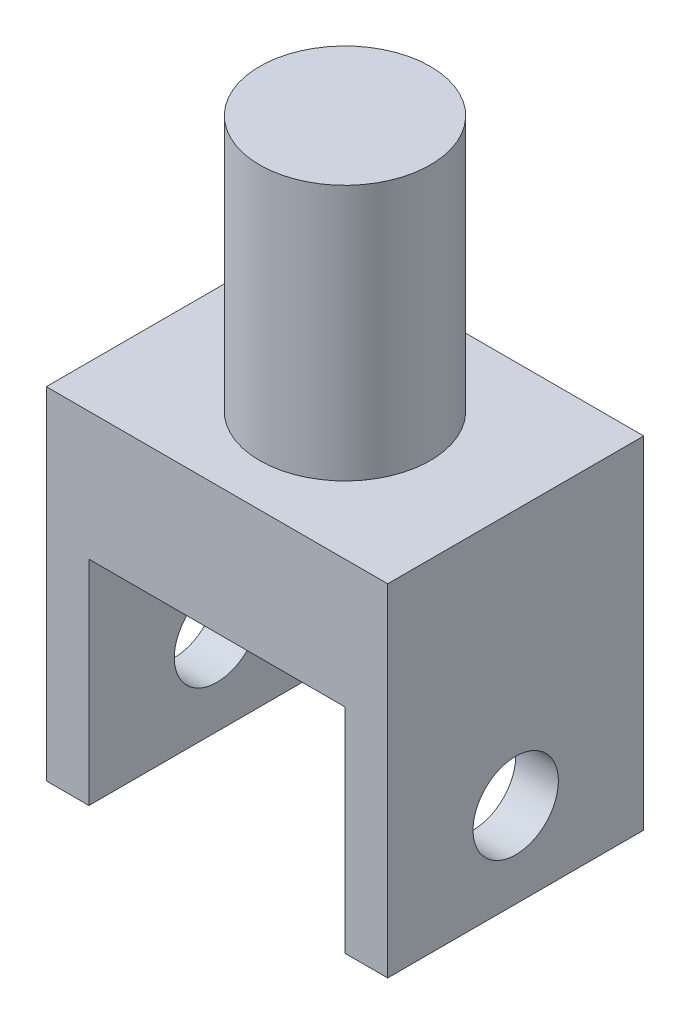
ISO-10303-21;
HEADER;
FILE_DESCRIPTION(('STEP AP214'),'2;1');
FILE_NAME('part.step','',(''),(''),'','','');
FILE_SCHEMA(('AUTOMOTIVE_DESIGN { 1 0 10303 214 1 1 1 1 }'));
ENDSEC;
DATA;
#1=APPLICATION_CONTEXT('core data for automotive mechanical design processes');
#2=APPLICATION_PROTOCOL_DEFINITION('international standard','automotive_design',2000,#1);
#3=PRODUCT_CONTEXT('',#1,'mechanical');
#4=PRODUCT('Part','Part','',(#3));
#5=PRODUCT_RELATED_PRODUCT_CATEGORY('part','',(#4));
#6=PRODUCT_DEFINITION_FORMATION('','',#4);
#7=PRODUCT_DEFINITION_CONTEXT('part definition',#1,'design');
#8=PRODUCT_DEFINITION('design','',#6,#7);
#9=PRODUCT_DEFINITION_SHAPE('','',#8);
#10=(LENGTH_UNIT() NAMED_UNIT(*) SI_UNIT(.MILLI.,.METRE.));
#11=(NAMED_UNIT(*) PLANE_ANGLE_UNIT() SI_UNIT($,.RADIAN.));
#12=(NAMED_UNIT(*) SI_UNIT($,.STERADIAN.) SOLID_ANGLE_UNIT());
#13=UNCERTAINTY_MEASURE_WITH_UNIT(LENGTH_MEASURE(1.E-05),#10,'distance_accuracy_value','');
#14=(GEOMETRIC_REPRESENTATION_CONTEXT(3) GLOBAL_UNCERTAINTY_ASSIGNED_CONTEXT((#13)) GLOBAL_UNIT_ASSIGNED_CONTEXT((#10,
#11,#12)) REPRESENTATION_CONTEXT('',''));
#15=CARTESIAN_POINT('',(0.,0.,0.));
#16=DIRECTION('',(0.,0.,1.));
#17=DIRECTION('',(1.,0.,0.));
#18=AXIS2_PLACEMENT_3D('',#15,#16,#17);
#19=CARTESIAN_POINT('',(0.,0.,0.));
#20=DIRECTION('',(0.,-1.,0.));
#21=DIRECTION('',(0.,0.,-1.));
#22=AXIS2_PLACEMENT_3D('',#19,#20,#21);
#23=PLANE('',#22);
#24=DIRECTION('',(0.,0.,1.));
#25=VECTOR('',#24,1.);
#26=CARTESIAN_POINT('',(38.1,0.,-38.1));
#27=LINE('',#26,#25);
#28=CARTESIAN_POINT('',(38.1,0.,-38.1));
#29=VERTEX_POINT('',#28);
#30=CARTESIAN_POINT('',(38.1,0.,38.1));
#31=VERTEX_POINT('',#30);
#32=EDGE_CURVE('E114',#29,#31,#27,.T.);
#33=ORIENTED_EDGE('',*,*,#32,.F.);
#34=DIRECTION('',(-1.,0.,0.));
#35=VECTOR('',#34,1.);
#36=CARTESIAN_POINT('',(-50.8,0.,-38.1));
#37=LINE('',#36,#35);
#38=CARTESIAN_POINT('',(50.8,0.,-38.1));
#39=VERTEX_POINT('',#38);
#40=EDGE_CURVE('E156',#39,#29,#37,.T.);
#41=ORIENTED_EDGE('',*,*,#40,.F.);
#42=DIRECTION('',(0.,0.,-1.));
#43=VECTOR('',#42,1.);
#44=CARTESIAN_POINT('',(50.8,0.,38.1));
#45=LINE('',#44,#43);
#46=CARTESIAN_POINT('',(50.8,0.,38.1));
#47=VERTEX_POINT('',#46);
#48=EDGE_CURVE('E140',#47,#39,#45,.T.);
#49=ORIENTED_EDGE('',*,*,#48,.F.);
#50=DIRECTION('',(1.,0.,0.));
#51=VECTOR('',#50,1.);
#52=CARTESIAN_POINT('',(-50.8,0.,38.1));
#53=LINE('',#52,#51);
#54=EDGE_CURVE('E80',#31,#47,#53,.T.);
#55=ORIENTED_EDGE('',*,*,#54,.F.);
#56=EDGE_LOOP('',(#33,#41,#49,#55));
#57=FACE_BOUND('',#56,.T.);
#58=ADVANCED_FACE('F33',(#57),#23,.T.);
#59=CARTESIAN_POINT('',(50.8,101.6,38.1));
#60=DIRECTION('',(-1.,0.,0.));
#61=DIRECTION('',(0.,0.,1.));
#62=AXIS2_PLACEMENT_3D('',#59,#60,#61);
#63=PLANE('',#62);
#64=CARTESIAN_POINT('',(50.8,25.4,0.));
#65=DIRECTION('',(1.,0.,0.));
#66=DIRECTION('',(0.,0.,-1.));
#67=AXIS2_PLACEMENT_3D('',#64,#65,#66);
#68=CIRCLE('',#67,12.7);
#69=CARTESIAN_POINT('',(50.8,25.4,-12.7));
#70=VERTEX_POINT('',#69);
#71=EDGE_CURVE('E227',#70,#70,#68,.T.);
#72=ORIENTED_EDGE('',*,*,#71,.F.);
#73=EDGE_LOOP('',(#72));
#74=FACE_BOUND('',#73,.T.);
#75=ORIENTED_EDGE('',*,*,#48,.T.);
#76=DIRECTION('',(0.,-1.,0.));
#77=VECTOR('',#76,1.);
#78=CARTESIAN_POINT('',(50.8,101.6,-38.1));
#79=LINE('',#78,#77);
#80=CARTESIAN_POINT('',(50.8,101.6,-38.1));
#81=VERTEX_POINT('',#80);
#82=EDGE_CURVE('E42',#81,#39,#79,.T.);
#83=ORIENTED_EDGE('',*,*,#82,.F.);
#84=DIRECTION('',(0.,0.,-1.));
#85=VECTOR('',#84,1.);
#86=CARTESIAN_POINT('',(50.8,101.6,38.1));
#87=LINE('',#86,#85);
#88=CARTESIAN_POINT('',(50.8,101.6,38.1));
#89=VERTEX_POINT('',#88);
#90=EDGE_CURVE('E145',#89,#81,#87,.T.);
#91=ORIENTED_EDGE('',*,*,#90,.F.);
#92=DIRECTION('',(0.,-1.,0.));
#93=VECTOR('',#92,1.);
#94=CARTESIAN_POINT('',(50.8,101.6,38.1));
#95=LINE('',#94,#93);
#96=EDGE_CURVE('E152',#89,#47,#95,.T.);
#97=ORIENTED_EDGE('',*,*,#96,.T.);
#98=EDGE_LOOP('',(#75,#83,#91,#97));
#99=FACE_BOUND('',#98,.T.);
#100=ADVANCED_FACE('F35',(#74,#99),#63,.F.);
#101=CARTESIAN_POINT('',(-50.8,101.6,-38.1));
#102=DIRECTION('',(0.,0.,1.));
#103=DIRECTION('',(1.,0.,0.));
#104=AXIS2_PLACEMENT_3D('',#101,#102,#103);
#105=PLANE('',#104);
#106=ORIENTED_EDGE('',*,*,#40,.T.);
#107=DIRECTION('',(0.,-1.,0.));
#108=VECTOR('',#107,1.);
#109=CARTESIAN_POINT('',(38.1,63.5,-38.1));
#110=LINE('',#109,#108);
#111=CARTESIAN_POINT('',(38.1,63.5,-38.1));
#112=VERTEX_POINT('',#111);
#113=EDGE_CURVE('E138',#112,#29,#110,.T.);
#114=ORIENTED_EDGE('',*,*,#113,.F.);
#115=DIRECTION('',(1.,0.,0.));
#116=VECTOR('',#115,1.);
#117=CARTESIAN_POINT('',(-38.1,63.5,-38.1));
#118=LINE('',#117,#116);
#119=CARTESIAN_POINT('',(-38.1,63.5,-38.1));
#120=VERTEX_POINT('',#119);
#121=EDGE_CURVE('E116',#120,#112,#118,.T.);
#122=ORIENTED_EDGE('',*,*,#121,.F.);
#123=DIRECTION('',(0.,-1.,0.));
#124=VECTOR('',#123,1.);
#125=CARTESIAN_POINT('',(-38.1,63.5,-38.1));
#126=LINE('',#125,#124);
#127=CARTESIAN_POINT('',(-38.1,0.,-38.1));
#128=VERTEX_POINT('',#127);
#129=EDGE_CURVE('E141',#120,#128,#126,.T.);
#130=ORIENTED_EDGE('',*,*,#129,.T.);
#131=CARTESIAN_POINT('',(-50.8,0.,-38.1));
#132=VERTEX_POINT('',#131);
#133=EDGE_CURVE('E155',#128,#132,#37,.T.);
#134=ORIENTED_EDGE('',*,*,#133,.T.);
#135=DIRECTION('',(0.,-1.,0.));
#136=VECTOR('',#135,1.);
#137=CARTESIAN_POINT('',(-50.8,101.6,-38.1));
#138=LINE('',#137,#136);
#139=CARTESIAN_POINT('',(-50.8,101.6,-38.1));
#140=VERTEX_POINT('',#139);
#141=EDGE_CURVE('E166',#140,#132,#138,.T.);
#142=ORIENTED_EDGE('',*,*,#141,.F.);
#143=DIRECTION('',(-1.,0.,0.));
#144=VECTOR('',#143,1.);
#145=CARTESIAN_POINT('',(-50.8,101.6,-38.1));
#146=LINE('',#145,#144);
#147=EDGE_CURVE('E88',#81,#140,#146,.T.);
#148=ORIENTED_EDGE('',*,*,#147,.F.);
#149=ORIENTED_EDGE('',*,*,#82,.T.);
#150=EDGE_LOOP('',(#106,#114,#122,#130,#134,#142,#148,#149));
#151=FACE_BOUND('',#150,.T.);
#152=ADVANCED_FACE('F169',(#151),#105,.F.);
#153=CARTESIAN_POINT('',(-50.8,101.6,38.1));
#154=DIRECTION('',(1.,0.,0.));
#155=DIRECTION('',(0.,0.,-1.));
#156=AXIS2_PLACEMENT_3D('',#153,#154,#155);
#157=PLANE('',#156);
#158=CARTESIAN_POINT('',(-50.8,25.4,0.));
#159=DIRECTION('',(1.,0.,0.));
#160=DIRECTION('',(0.,0.,-1.));
#161=AXIS2_PLACEMENT_3D('',#158,#159,#160);
#162=CIRCLE('',#161,12.7);
#163=CARTESIAN_POINT('',(-50.8,25.4,-12.7));
#164=VERTEX_POINT('',#163);
#165=EDGE_CURVE('E230',#164,#164,#162,.T.);
#166=ORIENTED_EDGE('',*,*,#165,.T.);
#167=EDGE_LOOP('',(#166));
#168=FACE_BOUND('',#167,.T.);
#169=DIRECTION('',(0.,0.,1.));
#170=VECTOR('',#169,1.);
#171=CARTESIAN_POINT('',(-50.8,0.,38.1));
#172=LINE('',#171,#170);
#173=CARTESIAN_POINT('',(-50.8,0.,38.1));
#174=VERTEX_POINT('',#173);
#175=EDGE_CURVE('E159',#132,#174,#172,.T.);
#176=ORIENTED_EDGE('',*,*,#175,.T.);
#177=DIRECTION('',(0.,-1.,0.));
#178=VECTOR('',#177,1.);
#179=CARTESIAN_POINT('',(-50.8,101.6,38.1));
#180=LINE('',#179,#178);
#181=CARTESIAN_POINT('',(-50.8,101.6,38.1));
#182=VERTEX_POINT('',#181);
#183=EDGE_CURVE('E163',#182,#174,#180,.T.);
#184=ORIENTED_EDGE('',*,*,#183,.F.);
#185=DIRECTION('',(0.,0.,1.));
#186=VECTOR('',#185,1.);
#187=CARTESIAN_POINT('',(-50.8,101.6,38.1));
#188=LINE('',#187,#186);
#189=EDGE_CURVE('E149',#140,#182,#188,.T.);
#190=ORIENTED_EDGE('',*,*,#189,.F.);
#191=ORIENTED_EDGE('',*,*,#141,.T.);
#192=EDGE_LOOP('',(#176,#184,#190,#191));
#193=FACE_BOUND('',#192,.T.);
#194=ADVANCED_FACE('F200',(#168,#193),#157,.F.);
#195=CARTESIAN_POINT('',(-50.8,101.6,38.1));
#196=DIRECTION('',(0.,0.,-1.));
#197=DIRECTION('',(-1.,0.,0.));
#198=AXIS2_PLACEMENT_3D('',#195,#196,#197);
#199=PLANE('',#198);
#200=DIRECTION('',(-1.,0.,0.));
#201=VECTOR('',#200,1.);
#202=CARTESIAN_POINT('',(-38.1,63.5,38.1));
#203=LINE('',#202,#201);
#204=CARTESIAN_POINT('',(38.1,63.5,38.1));
#205=VERTEX_POINT('',#204);
#206=CARTESIAN_POINT('',(-38.1,63.5,38.1));
#207=VERTEX_POINT('',#206);
#208=EDGE_CURVE('E122',#205,#207,#203,.T.);
#209=ORIENTED_EDGE('',*,*,#208,.F.);
#210=DIRECTION('',(0.,-1.,0.));
#211=VECTOR('',#210,1.);
#212=CARTESIAN_POINT('',(38.1,63.5,38.1));
#213=LINE('',#212,#211);
#214=EDGE_CURVE('E108',#205,#31,#213,.T.);
#215=ORIENTED_EDGE('',*,*,#214,.T.);
#216=ORIENTED_EDGE('',*,*,#54,.T.);
#217=ORIENTED_EDGE('',*,*,#96,.F.);
#218=DIRECTION('',(1.,0.,0.));
#219=VECTOR('',#218,1.);
#220=CARTESIAN_POINT('',(-50.8,101.6,38.1));
#221=LINE('',#220,#219);
#222=EDGE_CURVE('E59',#182,#89,#221,.T.);
#223=ORIENTED_EDGE('',*,*,#222,.F.);
#224=ORIENTED_EDGE('',*,*,#183,.T.);
#225=CARTESIAN_POINT('',(-38.1,0.,38.1));
#226=VERTEX_POINT('',#225);
#227=EDGE_CURVE('E147',#174,#226,#53,.T.);
#228=ORIENTED_EDGE('',*,*,#227,.T.);
#229=DIRECTION('',(0.,-1.,0.));
#230=VECTOR('',#229,1.);
#231=CARTESIAN_POINT('',(-38.1,63.5,38.1));
#232=LINE('',#231,#230);
#233=EDGE_CURVE('E50',#207,#226,#232,.T.);
#234=ORIENTED_EDGE('',*,*,#233,.F.);
#235=EDGE_LOOP('',(#209,#215,#216,#217,#223,#224,#228,#234));
#236=FACE_BOUND('',#235,.T.);
#237=ADVANCED_FACE('F127',(#236),#199,.F.);
#238=CARTESIAN_POINT('',(0.,101.6,0.));
#239=DIRECTION('',(0.,-1.,0.));
#240=DIRECTION('',(0.,0.,-1.));
#241=AXIS2_PLACEMENT_3D('',#238,#239,#240);
#242=PLANE('',#241);
#243=CARTESIAN_POINT('',(0.,101.6,0.));
#244=DIRECTION('',(0.,1.,0.));
#245=DIRECTION('',(0.,0.,1.));
#246=AXIS2_PLACEMENT_3D('',#243,#244,#245);
#247=CIRCLE('',#246,25.4);
#248=CARTESIAN_POINT('',(0.,101.6,-25.4));
#249=VERTEX_POINT('',#248);
#250=EDGE_CURVE('E11',#249,#249,#247,.T.);
#251=ORIENTED_EDGE('',*,*,#250,.F.);
#252=EDGE_LOOP('',(#251));
#253=FACE_BOUND('',#252,.T.);
#254=ORIENTED_EDGE('',*,*,#90,.T.);
#255=ORIENTED_EDGE('',*,*,#147,.T.);
#256=ORIENTED_EDGE('',*,*,#189,.T.);
#257=ORIENTED_EDGE('',*,*,#222,.T.);
#258=EDGE_LOOP('',(#254,#255,#256,#257));
#259=FACE_BOUND('',#258,.T.);
#260=ADVANCED_FACE('F184',(#253,#259),#242,.F.);
#261=DIRECTION('',(0.,0.,-1.));
#262=VECTOR('',#261,1.);
#263=CARTESIAN_POINT('',(-38.1,0.,-38.1));
#264=LINE('',#263,#262);
#265=EDGE_CURVE('E125',#226,#128,#264,.T.);
#266=ORIENTED_EDGE('',*,*,#265,.F.);
#267=ORIENTED_EDGE('',*,*,#227,.F.);
#268=ORIENTED_EDGE('',*,*,#175,.F.);
#269=ORIENTED_EDGE('',*,*,#133,.F.);
#270=EDGE_LOOP('',(#266,#267,#268,#269));
#271=FACE_BOUND('',#270,.T.);
#272=ADVANCED_FACE('F176',(#271),#23,.T.);
#273=CARTESIAN_POINT('',(38.1,63.5,-38.1));
#274=DIRECTION('',(1.,0.,0.));
#275=DIRECTION('',(0.,0.,-1.));
#276=AXIS2_PLACEMENT_3D('',#273,#274,#275);
#277=PLANE('',#276);
#278=CARTESIAN_POINT('',(38.1,25.4,0.));
#279=DIRECTION('',(1.,0.,0.));
#280=DIRECTION('',(0.,0.,-1.));
#281=AXIS2_PLACEMENT_3D('',#278,#279,#280);
#282=CIRCLE('',#281,12.7);
#283=CARTESIAN_POINT('',(38.1,25.4,-12.7));
#284=VERTEX_POINT('',#283);
#285=EDGE_CURVE('E136',#284,#284,#282,.T.);
#286=ORIENTED_EDGE('',*,*,#285,.T.);
#287=EDGE_LOOP('',(#286));
#288=FACE_BOUND('',#287,.T.);
#289=ORIENTED_EDGE('',*,*,#32,.T.);
#290=ORIENTED_EDGE('',*,*,#214,.F.);
#291=DIRECTION('',(0.,0.,1.));
#292=VECTOR('',#291,1.);
#293=CARTESIAN_POINT('',(38.1,63.5,-38.1));
#294=LINE('',#293,#292);
#295=EDGE_CURVE('E111',#112,#205,#294,.T.);
#296=ORIENTED_EDGE('',*,*,#295,.F.);
#297=ORIENTED_EDGE('',*,*,#113,.T.);
#298=EDGE_LOOP('',(#289,#290,#296,#297));
#299=FACE_BOUND('',#298,.T.);
#300=ADVANCED_FACE('F110',(#288,#299),#277,.F.);
#301=CARTESIAN_POINT('',(-38.1,63.5,-38.1));
#302=DIRECTION('',(-1.,0.,0.));
#303=DIRECTION('',(0.,0.,1.));
#304=AXIS2_PLACEMENT_3D('',#301,#302,#303);
#305=PLANE('',#304);
#306=CARTESIAN_POINT('',(-38.1,25.4,0.));
#307=DIRECTION('',(-1.,0.,0.));
#308=DIRECTION('',(0.,0.,1.));
#309=AXIS2_PLACEMENT_3D('',#306,#307,#308);
#310=CIRCLE('',#309,12.7);
#311=CARTESIAN_POINT('',(-38.1,25.4,12.7));
#312=VERTEX_POINT('',#311);
#313=EDGE_CURVE('E37',#312,#312,#310,.T.);
#314=ORIENTED_EDGE('',*,*,#313,.T.);
#315=EDGE_LOOP('',(#314));
#316=FACE_BOUND('',#315,.T.);
#317=ORIENTED_EDGE('',*,*,#265,.T.);
#318=ORIENTED_EDGE('',*,*,#129,.F.);
#319=DIRECTION('',(0.,0.,-1.));
#320=VECTOR('',#319,1.);
#321=CARTESIAN_POINT('',(-38.1,63.5,-38.1));
#322=LINE('',#321,#320);
#323=EDGE_CURVE('E129',#207,#120,#322,.T.);
#324=ORIENTED_EDGE('',*,*,#323,.F.);
#325=ORIENTED_EDGE('',*,*,#233,.T.);
#326=EDGE_LOOP('',(#317,#318,#324,#325));
#327=FACE_BOUND('',#326,.T.);
#328=ADVANCED_FACE('F190',(#316,#327),#305,.F.);
#329=CARTESIAN_POINT('',(0.,63.5,0.));
#330=DIRECTION('',(0.,1.,0.));
#331=DIRECTION('',(0.,0.,1.));
#332=AXIS2_PLACEMENT_3D('',#329,#330,#331);
#333=PLANE('',#332);
#334=ORIENTED_EDGE('',*,*,#295,.T.);
#335=ORIENTED_EDGE('',*,*,#208,.T.);
#336=ORIENTED_EDGE('',*,*,#323,.T.);
#337=ORIENTED_EDGE('',*,*,#121,.T.);
#338=EDGE_LOOP('',(#334,#335,#336,#337));
#339=FACE_BOUND('',#338,.T.);
#340=ADVANCED_FACE('F120',(#339),#333,.F.);
#341=CARTESIAN_POINT('',(-50.8,25.4,0.));
#342=DIRECTION('',(1.,0.,0.));
#343=DIRECTION('',(0.,0.,-1.));
#344=AXIS2_PLACEMENT_3D('',#341,#342,#343);
#345=CYLINDRICAL_SURFACE('',#344,12.7);
#346=ORIENTED_EDGE('',*,*,#165,.F.);
#347=EDGE_LOOP('',(#346));
#348=FACE_BOUND('',#347,.T.);
#349=ORIENTED_EDGE('',*,*,#313,.F.);
#350=EDGE_LOOP('',(#349));
#351=FACE_BOUND('',#350,.T.);
#352=ADVANCED_FACE('F207',(#348,#351),#345,.F.);
#353=ORIENTED_EDGE('',*,*,#71,.T.);
#354=EDGE_LOOP('',(#353));
#355=FACE_BOUND('',#354,.T.);
#356=ORIENTED_EDGE('',*,*,#285,.F.);
#357=EDGE_LOOP('',(#356));
#358=FACE_BOUND('',#357,.T.);
#359=ADVANCED_FACE('F211',(#355,#358),#345,.F.);
#360=CARTESIAN_POINT('',(0.,177.8,0.));
#361=DIRECTION('',(0.,-1.,0.));
#362=DIRECTION('',(0.,0.,-1.));
#363=AXIS2_PLACEMENT_3D('',#360,#361,#362);
#364=CYLINDRICAL_SURFACE('',#363,25.4);
#365=CARTESIAN_POINT('',(0.,177.8,0.));
#366=DIRECTION('',(0.,1.,0.));
#367=DIRECTION('',(0.,0.,1.));
#368=AXIS2_PLACEMENT_3D('',#365,#366,#367);
#369=CIRCLE('',#368,25.4);
#370=CARTESIAN_POINT('',(0.,177.8,-25.4));
#371=VERTEX_POINT('',#370);
#372=EDGE_CURVE('E226',#371,#371,#369,.T.);
#373=CARTESIAN_POINT('',(0.,177.8,-25.4));
#374=CARTESIAN_POINT('',(0.,177.00625,-25.4));
#375=CARTESIAN_POINT('',(0.,176.2125,-25.4));
#376=CARTESIAN_POINT('',(0.,174.625,-25.4));
#377=CARTESIAN_POINT('',(0.,173.83125,-25.4));
#378=CARTESIAN_POINT('',(0.,172.24375,-25.4));
#379=CARTESIAN_POINT('',(0.,171.45,-25.4));
#380=CARTESIAN_POINT('',(0.,169.8625,-25.4));
#381=CARTESIAN_POINT('',(0.,169.06875,-25.4));
#382=CARTESIAN_POINT('',(0.,167.48125,-25.4));
#383=CARTESIAN_POINT('',(0.,166.6875,-25.4));
#384=CARTESIAN_POINT('',(0.,165.1,-25.4));
#385=CARTESIAN_POINT('',(0.,164.30625,-25.4));
#386=CARTESIAN_POINT('',(0.,162.71875,-25.4));
#387=CARTESIAN_POINT('',(0.,161.925,-25.4));
#388=CARTESIAN_POINT('',(0.,160.3375,-25.4));
#389=CARTESIAN_POINT('',(0.,159.54375,-25.4));
#390=CARTESIAN_POINT('',(0.,157.95625,-25.4));
#391=CARTESIAN_POINT('',(0.,157.1625,-25.4));
#392=CARTESIAN_POINT('',(0.,155.575,-25.4));
#393=CARTESIAN_POINT('',(0.,154.78125,-25.4));
#394=CARTESIAN_POINT('',(0.,153.19375,-25.4));
#395=CARTESIAN_POINT('',(0.,152.4,-25.4));
#396=CARTESIAN_POINT('',(0.,150.8125,-25.4));
#397=CARTESIAN_POINT('',(0.,150.01875,-25.4));
#398=CARTESIAN_POINT('',(0.,148.43125,-25.4));
#399=CARTESIAN_POINT('',(0.,147.6375,-25.4));
#400=CARTESIAN_POINT('',(0.,146.05,-25.4));
#401=CARTESIAN_POINT('',(0.,145.25625,-25.4));
#402=CARTESIAN_POINT('',(0.,143.66875,-25.4));
#403=CARTESIAN_POINT('',(0.,142.875,-25.4));
#404=CARTESIAN_POINT('',(0.,141.2875,-25.4));
#405=CARTESIAN_POINT('',(0.,140.49375,-25.4));
#406=CARTESIAN_POINT('',(0.,138.90625,-25.4));
#407=CARTESIAN_POINT('',(0.,138.1125,-25.4));
#408=CARTESIAN_POINT('',(0.,136.525,-25.4));
#409=CARTESIAN_POINT('',(0.,135.73125,-25.4));
#410=CARTESIAN_POINT('',(0.,134.14375,-25.4));
#411=CARTESIAN_POINT('',(0.,133.35,-25.4));
#412=CARTESIAN_POINT('',(0.,131.7625,-25.4));
#413=CARTESIAN_POINT('',(0.,130.96875,-25.4));
#414=CARTESIAN_POINT('',(0.,129.38125,-25.4));
#415=CARTESIAN_POINT('',(0.,128.5875,-25.4));
#416=CARTESIAN_POINT('',(0.,127.,-25.4));
#417=CARTESIAN_POINT('',(0.,126.20625,-25.4));
#418=CARTESIAN_POINT('',(0.,124.61875,-25.4));
#419=CARTESIAN_POINT('',(0.,123.825,-25.4));
#420=CARTESIAN_POINT('',(0.,122.2375,-25.4));
#421=CARTESIAN_POINT('',(0.,121.44375,-25.4));
#422=CARTESIAN_POINT('',(0.,119.85625,-25.4));
#423=CARTESIAN_POINT('',(0.,119.0625,-25.4));
#424=CARTESIAN_POINT('',(0.,117.475,-25.4));
#425=CARTESIAN_POINT('',(0.,116.68125,-25.4));
#426=CARTESIAN_POINT('',(0.,115.09375,-25.4));
#427=CARTESIAN_POINT('',(0.,114.3,-25.4));
#428=CARTESIAN_POINT('',(0.,112.7125,-25.4));
#429=CARTESIAN_POINT('',(0.,111.91875,-25.4));
#430=CARTESIAN_POINT('',(0.,110.33125,-25.4));
#431=CARTESIAN_POINT('',(0.,109.5375,-25.4));
#432=CARTESIAN_POINT('',(0.,107.95,-25.4));
#433=CARTESIAN_POINT('',(0.,107.15625,-25.4));
#434=CARTESIAN_POINT('',(0.,105.56875,-25.4));
#435=CARTESIAN_POINT('',(0.,104.775,-25.4));
#436=CARTESIAN_POINT('',(0.,103.1875,-25.4));
#437=CARTESIAN_POINT('',(0.,102.39375,-25.4));
#438=CARTESIAN_POINT('',(0.,101.6,-25.4));
#439=B_SPLINE_CURVE_WITH_KNOTS('',3,(#373,#374,#375,#376,#377,#378,#379,#380,#381,#382,#383,
#384,#385,#386,#387,#388,#389,#390,#391,#392,#393,#394,#395,#396,#397,#398,#399,#400,#401,#402,
#403,#404,#405,#406,#407,#408,#409,#410,#411,#412,#413,#414,#415,#416,#417,#418,#419,#420,#421,
#422,#423,#424,#425,#426,#427,#428,#429,#430,#431,#432,#433,#434,#435,#436,#437,#438),
.UNSPECIFIED.,.F.,.F.,(4,2,2,2,2,2,2,2,2,2,2,2,2,2,2,2,2,2,2,2,2,2,2,2,2,2,2,2,2,2,2,2,4),(0.,
2.38124999999997,4.76249999999998,7.14374999999998,9.52499999999998,11.90625,14.2875,16.66875,
19.05,21.43125,23.8125,26.19375,28.575,30.95625,33.3375,35.71875,38.1,40.48125,42.8625,45.24375,
47.625,50.00625,52.3875,54.76875,57.15,59.53125,61.9125,64.29375,66.675,69.05625,71.4375,
73.81875,76.2),.UNSPECIFIED.);
#440=EDGE_CURVE('BSEAM214',#371,#249,#439,.T.);
#441=ORIENTED_EDGE('',*,*,#372,.F.);
#442=ORIENTED_EDGE('',*,*,#250,.T.);
#443=ORIENTED_EDGE('',*,*,#440,.T.);
#444=ORIENTED_EDGE('',*,*,#440,.F.);
#445=EDGE_LOOP('',(#441,#443,#442,#444));
#446=FACE_BOUND('',#445,.T.);
#447=ADVANCED_FACE('F214',(#446),#364,.T.);
#448=CARTESIAN_POINT('',(0.,177.8,0.));
#449=DIRECTION('',(0.,1.,0.));
#450=DIRECTION('',(0.,0.,1.));
#451=AXIS2_PLACEMENT_3D('',#448,#449,#450);
#452=PLANE('',#451);
#453=ORIENTED_EDGE('',*,*,#372,.T.);
#454=EDGE_LOOP('',(#453));
#455=FACE_BOUND('',#454,.T.);
#456=ADVANCED_FACE('F218',(#455),#452,.T.);
#457=CLOSED_SHELL('',(#58,#100,#152,#194,#237,#260,#272,#300,#328,#340,#352,#359,#447,#456));
#458=MANIFOLD_SOLID_BREP('B2',#457);
#459=ADVANCED_BREP_SHAPE_REPRESENTATION('',(#18,#458),#14);
#460=SHAPE_DEFINITION_REPRESENTATION(#9,#459);
ENDSEC;
END-ISO-10303-21;
